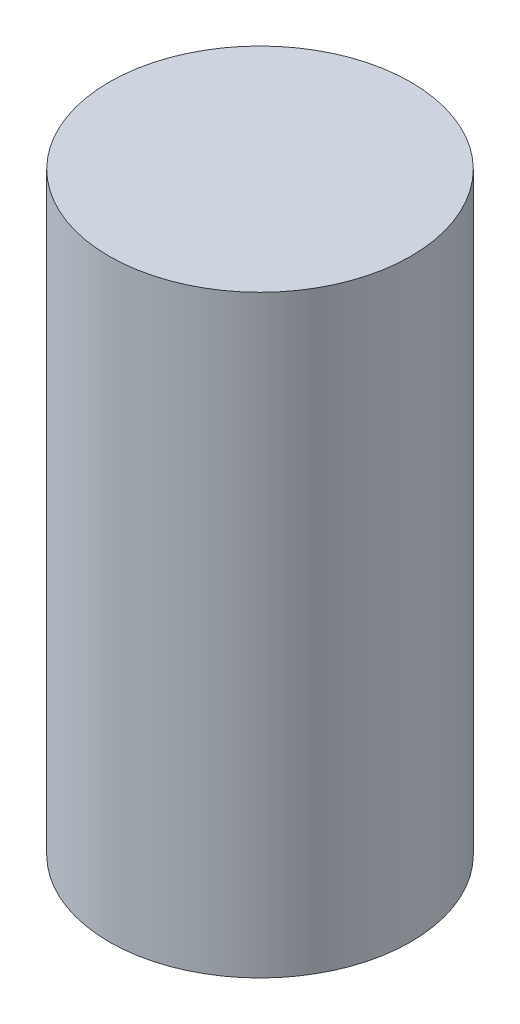
ISO-10303-21;
HEADER;
FILE_DESCRIPTION(('STEP AP214'),'2;1');
FILE_NAME('part.step','',(''),(''),'','','');
FILE_SCHEMA(('AUTOMOTIVE_DESIGN { 1 0 10303 214 1 1 1 1 }'));
ENDSEC;
DATA;
#1=APPLICATION_CONTEXT('core data for automotive mechanical design processes');
#2=APPLICATION_PROTOCOL_DEFINITION('international standard','automotive_design',2000,#1);
#3=PRODUCT_CONTEXT('',#1,'mechanical');
#4=PRODUCT('Part','Part','',(#3));
#5=PRODUCT_RELATED_PRODUCT_CATEGORY('part','',(#4));
#6=PRODUCT_DEFINITION_FORMATION('','',#4);
#7=PRODUCT_DEFINITION_CONTEXT('part definition',#1,'design');
#8=PRODUCT_DEFINITION('design','',#6,#7);
#9=PRODUCT_DEFINITION_SHAPE('','',#8);
#10=(LENGTH_UNIT() NAMED_UNIT(*) SI_UNIT(.MILLI.,.METRE.));
#11=(NAMED_UNIT(*) PLANE_ANGLE_UNIT() SI_UNIT($,.RADIAN.));
#12=(NAMED_UNIT(*) SI_UNIT($,.STERADIAN.) SOLID_ANGLE_UNIT());
#13=UNCERTAINTY_MEASURE_WITH_UNIT(LENGTH_MEASURE(1.E-05),#10,'distance_accuracy_value','');
#14=(GEOMETRIC_REPRESENTATION_CONTEXT(3) GLOBAL_UNCERTAINTY_ASSIGNED_CONTEXT((#13)) GLOBAL_UNIT_ASSIGNED_CONTEXT((#10,
#11,#12)) REPRESENTATION_CONTEXT('',''));
#15=CARTESIAN_POINT('',(0.,0.,0.));
#16=DIRECTION('',(0.,0.,1.));
#17=DIRECTION('',(1.,0.,0.));
#18=AXIS2_PLACEMENT_3D('',#15,#16,#17);
#19=CARTESIAN_POINT('',(0.,10.,0.));
#20=DIRECTION('',(0.,-1.,0.));
#21=DIRECTION('',(0.,0.,-1.));
#22=AXIS2_PLACEMENT_3D('',#19,#20,#21);
#23=CYLINDRICAL_SURFACE('',#22,2.54);
#24=CARTESIAN_POINT('',(0.,10.,0.));
#25=DIRECTION('',(0.,1.,0.));
#26=DIRECTION('',(0.,0.,1.));
#27=AXIS2_PLACEMENT_3D('',#24,#25,#26);
#28=CIRCLE('',#27,2.54);
#29=CARTESIAN_POINT('',(0.,10.,2.54));
#30=VERTEX_POINT('',#29);
#31=EDGE_CURVE('E10',#30,#30,#28,.T.);
#32=ORIENTED_EDGE('',*,*,#31,.F.);
#33=EDGE_LOOP('',(#32));
#34=FACE_BOUND('',#33,.T.);
#35=CARTESIAN_POINT('',(0.,0.,0.));
#36=DIRECTION('',(0.,1.,0.));
#37=DIRECTION('',(0.,0.,1.));
#38=AXIS2_PLACEMENT_3D('',#35,#36,#37);
#39=CIRCLE('',#38,2.54);
#40=CARTESIAN_POINT('',(0.,0.,2.54));
#41=VERTEX_POINT('',#40);
#42=EDGE_CURVE('E34',#41,#41,#39,.T.);
#43=ORIENTED_EDGE('',*,*,#42,.T.);
#44=EDGE_LOOP('',(#43));
#45=FACE_BOUND('',#44,.T.);
#46=ADVANCED_FACE('F31',(#34,#45),#23,.T.);
#47=CARTESIAN_POINT('',(0.,10.,0.));
#48=DIRECTION('',(0.,1.,0.));
#49=DIRECTION('',(0.,0.,1.));
#50=AXIS2_PLACEMENT_3D('',#47,#48,#49);
#51=PLANE('',#50);
#52=ORIENTED_EDGE('',*,*,#31,.T.);
#53=EDGE_LOOP('',(#52));
#54=FACE_BOUND('',#53,.T.);
#55=ADVANCED_FACE('F46',(#54),#51,.T.);
#56=CARTESIAN_POINT('',(0.,0.,0.));
#57=DIRECTION('',(0.,1.,0.));
#58=DIRECTION('',(0.,0.,1.));
#59=AXIS2_PLACEMENT_3D('',#56,#57,#58);
#60=PLANE('',#59);
#61=ORIENTED_EDGE('',*,*,#42,.F.);
#62=EDGE_LOOP('',(#61));
#63=FACE_BOUND('',#62,.T.);
#64=ADVANCED_FACE('F44',(#63),#60,.F.);
#65=CLOSED_SHELL('',(#46,#55,#64));
#66=MANIFOLD_SOLID_BREP('B2',#65);
#67=ADVANCED_BREP_SHAPE_REPRESENTATION('',(#18,#66),#14);
#68=SHAPE_DEFINITION_REPRESENTATION(#9,#67);
ENDSEC;
END-ISO-10303-21;
